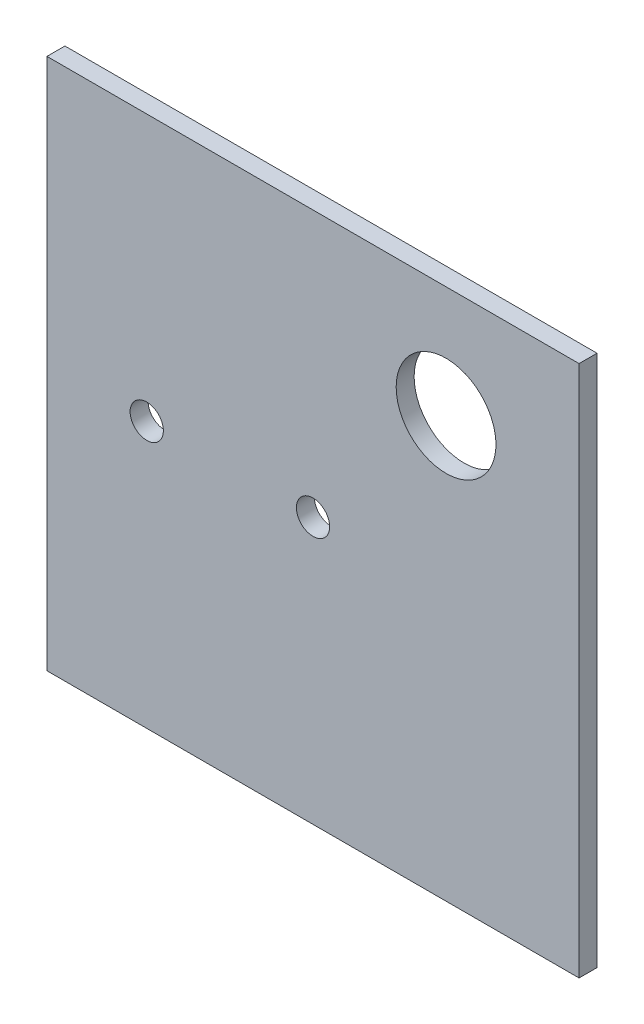
ISO-10303-21;
HEADER;
FILE_DESCRIPTION(('STEP AP214'),'2;1');
FILE_NAME('part.step','',(''),(''),'','','');
FILE_SCHEMA(('AUTOMOTIVE_DESIGN { 1 0 10303 214 1 1 1 1 }'));
ENDSEC;
DATA;
#1=APPLICATION_CONTEXT('core data for automotive mechanical design processes');
#2=APPLICATION_PROTOCOL_DEFINITION('international standard','automotive_design',2000,#1);
#3=PRODUCT_CONTEXT('',#1,'mechanical');
#4=PRODUCT('Part','Part','',(#3));
#5=PRODUCT_RELATED_PRODUCT_CATEGORY('part','',(#4));
#6=PRODUCT_DEFINITION_FORMATION('','',#4);
#7=PRODUCT_DEFINITION_CONTEXT('part definition',#1,'design');
#8=PRODUCT_DEFINITION('design','',#6,#7);
#9=PRODUCT_DEFINITION_SHAPE('','',#8);
#10=(LENGTH_UNIT() NAMED_UNIT(*) SI_UNIT(.MILLI.,.METRE.));
#11=(NAMED_UNIT(*) PLANE_ANGLE_UNIT() SI_UNIT($,.RADIAN.));
#12=(NAMED_UNIT(*) SI_UNIT($,.STERADIAN.) SOLID_ANGLE_UNIT());
#13=UNCERTAINTY_MEASURE_WITH_UNIT(LENGTH_MEASURE(1.E-05),#10,'distance_accuracy_value','');
#14=(GEOMETRIC_REPRESENTATION_CONTEXT(3) GLOBAL_UNCERTAINTY_ASSIGNED_CONTEXT((#13)) GLOBAL_UNIT_ASSIGNED_CONTEXT((#10,
#11,#12)) REPRESENTATION_CONTEXT('',''));
#15=CARTESIAN_POINT('',(0.,0.,0.));
#16=DIRECTION('',(0.,0.,1.));
#17=DIRECTION('',(1.,0.,0.));
#18=AXIS2_PLACEMENT_3D('',#15,#16,#17);
#19=CARTESIAN_POINT('',(-82.7,40.,-2.7));
#20=DIRECTION('',(-1.,0.,0.));
#21=DIRECTION('',(0.,0.,1.));
#22=AXIS2_PLACEMENT_3D('',#19,#20,#21);
#23=PLANE('',#22);
#24=DIRECTION('',(0.,-1.,0.));
#25=VECTOR('',#24,1.);
#26=CARTESIAN_POINT('',(-82.7,40.,0.));
#27=LINE('',#26,#25);
#28=CARTESIAN_POINT('',(-82.7,40.,0.));
#29=VERTEX_POINT('',#28);
#30=CARTESIAN_POINT('',(-82.7,-40.,0.));
#31=VERTEX_POINT('',#30);
#32=EDGE_CURVE('E110',#29,#31,#27,.T.);
#33=ORIENTED_EDGE('',*,*,#32,.F.);
#34=DIRECTION('',(0.,0.,1.));
#35=VECTOR('',#34,1.);
#36=CARTESIAN_POINT('',(-82.7,40.,-2.7));
#37=LINE('',#36,#35);
#38=CARTESIAN_POINT('',(-82.7,40.,-2.7));
#39=VERTEX_POINT('',#38);
#40=EDGE_CURVE('E13',#39,#29,#37,.T.);
#41=ORIENTED_EDGE('',*,*,#40,.F.);
#42=DIRECTION('',(0.,-1.,0.));
#43=VECTOR('',#42,1.);
#44=CARTESIAN_POINT('',(-82.7,40.,-2.7));
#45=LINE('',#44,#43);
#46=CARTESIAN_POINT('',(-82.7,-40.,-2.7));
#47=VERTEX_POINT('',#46);
#48=EDGE_CURVE('E103',#39,#47,#45,.T.);
#49=ORIENTED_EDGE('',*,*,#48,.T.);
#50=DIRECTION('',(0.,0.,1.));
#51=VECTOR('',#50,1.);
#52=CARTESIAN_POINT('',(-82.7,-40.,-2.7));
#53=LINE('',#52,#51);
#54=EDGE_CURVE('E48',#47,#31,#53,.T.);
#55=ORIENTED_EDGE('',*,*,#54,.T.);
#56=EDGE_LOOP('',(#33,#41,#49,#55));
#57=FACE_BOUND('',#56,.T.);
#58=ADVANCED_FACE('F45',(#57),#23,.T.);
#59=CARTESIAN_POINT('',(-82.7,40.,-2.7));
#60=DIRECTION('',(0.,1.,0.));
#61=DIRECTION('',(0.,0.,1.));
#62=AXIS2_PLACEMENT_3D('',#59,#60,#61);
#63=PLANE('',#62);
#64=DIRECTION('',(-1.,0.,0.));
#65=VECTOR('',#64,1.);
#66=CARTESIAN_POINT('',(-82.7,40.,0.));
#67=LINE('',#66,#65);
#68=CARTESIAN_POINT('',(-2.7,40.,0.));
#69=VERTEX_POINT('',#68);
#70=EDGE_CURVE('E105',#69,#29,#67,.T.);
#71=ORIENTED_EDGE('',*,*,#70,.F.);
#72=DIRECTION('',(0.,0.,1.));
#73=VECTOR('',#72,1.);
#74=CARTESIAN_POINT('',(-2.7,40.,-2.7));
#75=LINE('',#74,#73);
#76=CARTESIAN_POINT('',(-2.7,40.,-2.7));
#77=VERTEX_POINT('',#76);
#78=EDGE_CURVE('E54',#77,#69,#75,.T.);
#79=ORIENTED_EDGE('',*,*,#78,.F.);
#80=DIRECTION('',(-1.,0.,0.));
#81=VECTOR('',#80,1.);
#82=CARTESIAN_POINT('',(-82.7,40.,-2.7));
#83=LINE('',#82,#81);
#84=EDGE_CURVE('E100',#77,#39,#83,.T.);
#85=ORIENTED_EDGE('',*,*,#84,.T.);
#86=ORIENTED_EDGE('',*,*,#40,.T.);
#87=EDGE_LOOP('',(#71,#79,#85,#86));
#88=FACE_BOUND('',#87,.T.);
#89=ADVANCED_FACE('F121',(#88),#63,.T.);
#90=CARTESIAN_POINT('',(-2.7,40.,-2.7));
#91=DIRECTION('',(1.,0.,0.));
#92=DIRECTION('',(0.,0.,-1.));
#93=AXIS2_PLACEMENT_3D('',#90,#91,#92);
#94=PLANE('',#93);
#95=DIRECTION('',(0.,1.,0.));
#96=VECTOR('',#95,1.);
#97=CARTESIAN_POINT('',(-2.7,40.,0.));
#98=LINE('',#97,#96);
#99=CARTESIAN_POINT('',(-2.7,-40.,0.));
#100=VERTEX_POINT('',#99);
#101=EDGE_CURVE('E95',#100,#69,#98,.T.);
#102=ORIENTED_EDGE('',*,*,#101,.F.);
#103=DIRECTION('',(0.,0.,1.));
#104=VECTOR('',#103,1.);
#105=CARTESIAN_POINT('',(-2.7,-40.,-2.7));
#106=LINE('',#105,#104);
#107=CARTESIAN_POINT('',(-2.7,-40.,-2.7));
#108=VERTEX_POINT('',#107);
#109=EDGE_CURVE('E90',#108,#100,#106,.T.);
#110=ORIENTED_EDGE('',*,*,#109,.F.);
#111=DIRECTION('',(0.,1.,0.));
#112=VECTOR('',#111,1.);
#113=CARTESIAN_POINT('',(-2.7,40.,-2.7));
#114=LINE('',#113,#112);
#115=EDGE_CURVE('E93',#108,#77,#114,.T.);
#116=ORIENTED_EDGE('',*,*,#115,.T.);
#117=ORIENTED_EDGE('',*,*,#78,.T.);
#118=EDGE_LOOP('',(#102,#110,#116,#117));
#119=FACE_BOUND('',#118,.T.);
#120=ADVANCED_FACE('F92',(#119),#94,.T.);
#121=CARTESIAN_POINT('',(-82.7,-40.,-2.7));
#122=DIRECTION('',(0.,-1.,0.));
#123=DIRECTION('',(0.,0.,-1.));
#124=AXIS2_PLACEMENT_3D('',#121,#122,#123);
#125=PLANE('',#124);
#126=DIRECTION('',(1.,0.,0.));
#127=VECTOR('',#126,1.);
#128=CARTESIAN_POINT('',(-82.7,-40.,0.));
#129=LINE('',#128,#127);
#130=EDGE_CURVE('E113',#31,#100,#129,.T.);
#131=ORIENTED_EDGE('',*,*,#130,.F.);
#132=ORIENTED_EDGE('',*,*,#54,.F.);
#133=DIRECTION('',(1.,0.,0.));
#134=VECTOR('',#133,1.);
#135=CARTESIAN_POINT('',(-82.7,-40.,-2.7));
#136=LINE('',#135,#134);
#137=EDGE_CURVE('E99',#47,#108,#136,.T.);
#138=ORIENTED_EDGE('',*,*,#137,.T.);
#139=ORIENTED_EDGE('',*,*,#109,.T.);
#140=EDGE_LOOP('',(#131,#132,#138,#139));
#141=FACE_BOUND('',#140,.T.);
#142=ADVANCED_FACE('F102',(#141),#125,.T.);
#143=CARTESIAN_POINT('',(0.,0.,-2.7));
#144=DIRECTION('',(0.,0.,1.));
#145=DIRECTION('',(1.,0.,0.));
#146=AXIS2_PLACEMENT_3D('',#143,#144,#145);
#147=PLANE('',#146);
#148=CARTESIAN_POINT('',(-22.7,23.2,-2.7));
#149=DIRECTION('',(0.,0.,-1.));
#150=DIRECTION('',(-1.,0.,0.));
#151=AXIS2_PLACEMENT_3D('',#148,#149,#150);
#152=CIRCLE('',#151,7.5);
#153=CARTESIAN_POINT('',(-30.2,23.2,-2.7));
#154=VERTEX_POINT('',#153);
#155=EDGE_CURVE('E161',#154,#154,#152,.T.);
#156=ORIENTED_EDGE('',*,*,#155,.F.);
#157=EDGE_LOOP('',(#156));
#158=FACE_BOUND('',#157,.T.);
#159=CARTESIAN_POINT('',(-67.7,0.,-2.7));
#160=DIRECTION('',(0.,0.,-1.));
#161=DIRECTION('',(-1.,0.,0.));
#162=AXIS2_PLACEMENT_3D('',#159,#160,#161);
#163=CIRCLE('',#162,2.49999999999999);
#164=CARTESIAN_POINT('',(-70.2,0.,-2.7));
#165=VERTEX_POINT('',#164);
#166=EDGE_CURVE('E168',#165,#165,#163,.T.);
#167=ORIENTED_EDGE('',*,*,#166,.F.);
#168=EDGE_LOOP('',(#167));
#169=FACE_BOUND('',#168,.T.);
#170=CARTESIAN_POINT('',(-42.7,0.,-2.7));
#171=DIRECTION('',(0.,0.,-1.));
#172=DIRECTION('',(-1.,0.,0.));
#173=AXIS2_PLACEMENT_3D('',#170,#171,#172);
#174=CIRCLE('',#173,2.5);
#175=CARTESIAN_POINT('',(-45.2,0.,-2.7));
#176=VERTEX_POINT('',#175);
#177=EDGE_CURVE('E163',#176,#176,#174,.T.);
#178=ORIENTED_EDGE('',*,*,#177,.F.);
#179=EDGE_LOOP('',(#178));
#180=FACE_BOUND('',#179,.T.);
#181=ORIENTED_EDGE('',*,*,#48,.F.);
#182=ORIENTED_EDGE('',*,*,#84,.F.);
#183=ORIENTED_EDGE('',*,*,#115,.F.);
#184=ORIENTED_EDGE('',*,*,#137,.F.);
#185=EDGE_LOOP('',(#181,#182,#183,#184));
#186=FACE_BOUND('',#185,.T.);
#187=ADVANCED_FACE('F98',(#158,#169,#180,#186),#147,.F.);
#188=CARTESIAN_POINT('',(0.,0.,0.));
#189=DIRECTION('',(0.,0.,1.));
#190=DIRECTION('',(1.,0.,0.));
#191=AXIS2_PLACEMENT_3D('',#188,#189,#190);
#192=PLANE('',#191);
#193=CARTESIAN_POINT('',(-22.7,23.2,0.));
#194=DIRECTION('',(0.,0.,-1.));
#195=DIRECTION('',(-1.,0.,0.));
#196=AXIS2_PLACEMENT_3D('',#193,#194,#195);
#197=CIRCLE('',#196,7.5);
#198=CARTESIAN_POINT('',(-30.2,23.2,0.));
#199=VERTEX_POINT('',#198);
#200=EDGE_CURVE('E159',#199,#199,#197,.T.);
#201=ORIENTED_EDGE('',*,*,#200,.T.);
#202=EDGE_LOOP('',(#201));
#203=FACE_BOUND('',#202,.T.);
#204=CARTESIAN_POINT('',(-67.7,0.,0.));
#205=DIRECTION('',(0.,0.,-1.));
#206=DIRECTION('',(-1.,0.,0.));
#207=AXIS2_PLACEMENT_3D('',#204,#205,#206);
#208=CIRCLE('',#207,2.49999999999999);
#209=CARTESIAN_POINT('',(-70.2,0.,0.));
#210=VERTEX_POINT('',#209);
#211=EDGE_CURVE('E114',#210,#210,#208,.T.);
#212=ORIENTED_EDGE('',*,*,#211,.T.);
#213=EDGE_LOOP('',(#212));
#214=FACE_BOUND('',#213,.T.);
#215=CARTESIAN_POINT('',(-42.7,0.,0.));
#216=DIRECTION('',(0.,0.,-1.));
#217=DIRECTION('',(-1.,0.,0.));
#218=AXIS2_PLACEMENT_3D('',#215,#216,#217);
#219=CIRCLE('',#218,2.5);
#220=CARTESIAN_POINT('',(-45.2,0.,0.));
#221=VERTEX_POINT('',#220);
#222=EDGE_CURVE('E171',#221,#221,#219,.T.);
#223=ORIENTED_EDGE('',*,*,#222,.T.);
#224=EDGE_LOOP('',(#223));
#225=FACE_BOUND('',#224,.T.);
#226=ORIENTED_EDGE('',*,*,#32,.T.);
#227=ORIENTED_EDGE('',*,*,#130,.T.);
#228=ORIENTED_EDGE('',*,*,#101,.T.);
#229=ORIENTED_EDGE('',*,*,#70,.T.);
#230=EDGE_LOOP('',(#226,#227,#228,#229));
#231=FACE_BOUND('',#230,.T.);
#232=ADVANCED_FACE('F120',(#203,#214,#225,#231),#192,.T.);
#233=CARTESIAN_POINT('',(-42.7,0.,0.));
#234=DIRECTION('',(0.,0.,-1.));
#235=DIRECTION('',(-1.,0.,0.));
#236=AXIS2_PLACEMENT_3D('',#233,#234,#235);
#237=CYLINDRICAL_SURFACE('',#236,2.5);
#238=CARTESIAN_POINT('',(-45.2,0.,0.));
#239=CARTESIAN_POINT('',(-45.2,0.,-0.028125));
#240=CARTESIAN_POINT('',(-45.2,0.,-0.05625));
#241=CARTESIAN_POINT('',(-45.2,0.,-0.1125));
#242=CARTESIAN_POINT('',(-45.2,0.,-0.140625));
#243=CARTESIAN_POINT('',(-45.2,0.,-0.196875));
#244=CARTESIAN_POINT('',(-45.2,0.,-0.225));
#245=CARTESIAN_POINT('',(-45.2,0.,-0.28125));
#246=CARTESIAN_POINT('',(-45.2,0.,-0.309375));
#247=CARTESIAN_POINT('',(-45.2,0.,-0.365625));
#248=CARTESIAN_POINT('',(-45.2,0.,-0.39375));
#249=CARTESIAN_POINT('',(-45.2,0.,-0.45));
#250=CARTESIAN_POINT('',(-45.2,0.,-0.478125));
#251=CARTESIAN_POINT('',(-45.2,0.,-0.534375));
#252=CARTESIAN_POINT('',(-45.2,0.,-0.5625));
#253=CARTESIAN_POINT('',(-45.2,0.,-0.61875));
#254=CARTESIAN_POINT('',(-45.2,0.,-0.646875));
#255=CARTESIAN_POINT('',(-45.2,0.,-0.703125));
#256=CARTESIAN_POINT('',(-45.2,0.,-0.73125));
#257=CARTESIAN_POINT('',(-45.2,0.,-0.7875));
#258=CARTESIAN_POINT('',(-45.2,0.,-0.815625));
#259=CARTESIAN_POINT('',(-45.2,0.,-0.871875));
#260=CARTESIAN_POINT('',(-45.2,0.,-0.9));
#261=CARTESIAN_POINT('',(-45.2,0.,-0.95625));
#262=CARTESIAN_POINT('',(-45.2,0.,-0.984375));
#263=CARTESIAN_POINT('',(-45.2,0.,-1.040625));
#264=CARTESIAN_POINT('',(-45.2,0.,-1.06875));
#265=CARTESIAN_POINT('',(-45.2,0.,-1.125));
#266=CARTESIAN_POINT('',(-45.2,0.,-1.153125));
#267=CARTESIAN_POINT('',(-45.2,0.,-1.209375));
#268=CARTESIAN_POINT('',(-45.2,0.,-1.2375));
#269=CARTESIAN_POINT('',(-45.2,0.,-1.29375));
#270=CARTESIAN_POINT('',(-45.2,0.,-1.321875));
#271=CARTESIAN_POINT('',(-45.2,0.,-1.378125));
#272=CARTESIAN_POINT('',(-45.2,0.,-1.40625));
#273=CARTESIAN_POINT('',(-45.2,0.,-1.4625));
#274=CARTESIAN_POINT('',(-45.2,0.,-1.490625));
#275=CARTESIAN_POINT('',(-45.2,0.,-1.546875));
#276=CARTESIAN_POINT('',(-45.2,0.,-1.575));
#277=CARTESIAN_POINT('',(-45.2,0.,-1.63125));
#278=CARTESIAN_POINT('',(-45.2,0.,-1.659375));
#279=CARTESIAN_POINT('',(-45.2,0.,-1.715625));
#280=CARTESIAN_POINT('',(-45.2,0.,-1.74375));
#281=CARTESIAN_POINT('',(-45.2,0.,-1.8));
#282=CARTESIAN_POINT('',(-45.2,0.,-1.828125));
#283=CARTESIAN_POINT('',(-45.2,0.,-1.884375));
#284=CARTESIAN_POINT('',(-45.2,0.,-1.9125));
#285=CARTESIAN_POINT('',(-45.2,0.,-1.96875));
#286=CARTESIAN_POINT('',(-45.2,0.,-1.996875));
#287=CARTESIAN_POINT('',(-45.2,0.,-2.053125));
#288=CARTESIAN_POINT('',(-45.2,0.,-2.08125));
#289=CARTESIAN_POINT('',(-45.2,0.,-2.1375));
#290=CARTESIAN_POINT('',(-45.2,0.,-2.165625));
#291=CARTESIAN_POINT('',(-45.2,0.,-2.221875));
#292=CARTESIAN_POINT('',(-45.2,0.,-2.25));
#293=CARTESIAN_POINT('',(-45.2,0.,-2.30625));
#294=CARTESIAN_POINT('',(-45.2,0.,-2.334375));
#295=CARTESIAN_POINT('',(-45.2,0.,-2.390625));
#296=CARTESIAN_POINT('',(-45.2,0.,-2.41875));
#297=CARTESIAN_POINT('',(-45.2,0.,-2.475));
#298=CARTESIAN_POINT('',(-45.2,0.,-2.503125));
#299=CARTESIAN_POINT('',(-45.2,0.,-2.559375));
#300=CARTESIAN_POINT('',(-45.2,0.,-2.5875));
#301=CARTESIAN_POINT('',(-45.2,0.,-2.64375));
#302=CARTESIAN_POINT('',(-45.2,0.,-2.671875));
#303=CARTESIAN_POINT('',(-45.2,0.,-2.7));
#304=B_SPLINE_CURVE_WITH_KNOTS('',3,(#238,#239,#240,#241,#242,#243,#244,#245,#246,#247,#248,
#249,#250,#251,#252,#253,#254,#255,#256,#257,#258,#259,#260,#261,#262,#263,#264,#265,#266,#267,
#268,#269,#270,#271,#272,#273,#274,#275,#276,#277,#278,#279,#280,#281,#282,#283,#284,#285,#286,
#287,#288,#289,#290,#291,#292,#293,#294,#295,#296,#297,#298,#299,#300,#301,#302,#303),
.UNSPECIFIED.,.F.,.F.,(4,2,2,2,2,2,2,2,2,2,2,2,2,2,2,2,2,2,2,2,2,2,2,2,2,2,2,2,2,2,2,2,4),(0.,
0.084375,0.16875,0.253125,0.3375,0.421875,0.50625,0.590625,0.675,0.759375,0.84375,0.928125,
1.0125,1.096875,1.18125,1.265625,1.35,1.434375,1.51875,1.603125,1.6875,1.771875,1.85625,
1.940625,2.025,2.109375,2.19375,2.278125,2.3625,2.446875,2.53125,2.615625,2.7),.UNSPECIFIED.);
#305=EDGE_CURVE('BSEAM139',#221,#176,#304,.T.);
#306=ORIENTED_EDGE('',*,*,#222,.F.);
#307=ORIENTED_EDGE('',*,*,#177,.T.);
#308=ORIENTED_EDGE('',*,*,#305,.T.);
#309=ORIENTED_EDGE('',*,*,#305,.F.);
#310=EDGE_LOOP('',(#306,#308,#307,#309));
#311=FACE_BOUND('',#310,.T.);
#312=ADVANCED_FACE('F139',(#311),#237,.F.);
#313=CARTESIAN_POINT('',(-67.7,0.,0.));
#314=DIRECTION('',(0.,0.,-1.));
#315=DIRECTION('',(-1.,0.,0.));
#316=AXIS2_PLACEMENT_3D('',#313,#314,#315);
#317=CYLINDRICAL_SURFACE('',#316,2.49999999999999);
#318=CARTESIAN_POINT('',(-70.2,0.,0.));
#319=CARTESIAN_POINT('',(-70.2,0.,-0.028125));
#320=CARTESIAN_POINT('',(-70.2,0.,-0.05625));
#321=CARTESIAN_POINT('',(-70.2,0.,-0.1125));
#322=CARTESIAN_POINT('',(-70.2,0.,-0.140625));
#323=CARTESIAN_POINT('',(-70.2,0.,-0.196875));
#324=CARTESIAN_POINT('',(-70.2,0.,-0.225));
#325=CARTESIAN_POINT('',(-70.2,0.,-0.28125));
#326=CARTESIAN_POINT('',(-70.2,0.,-0.309375));
#327=CARTESIAN_POINT('',(-70.2,0.,-0.365625));
#328=CARTESIAN_POINT('',(-70.2,0.,-0.39375));
#329=CARTESIAN_POINT('',(-70.2,0.,-0.45));
#330=CARTESIAN_POINT('',(-70.2,0.,-0.478125));
#331=CARTESIAN_POINT('',(-70.2,0.,-0.534375));
#332=CARTESIAN_POINT('',(-70.2,0.,-0.5625));
#333=CARTESIAN_POINT('',(-70.2,0.,-0.61875));
#334=CARTESIAN_POINT('',(-70.2,0.,-0.646875));
#335=CARTESIAN_POINT('',(-70.2,0.,-0.703125));
#336=CARTESIAN_POINT('',(-70.2,0.,-0.73125));
#337=CARTESIAN_POINT('',(-70.2,0.,-0.7875));
#338=CARTESIAN_POINT('',(-70.2,0.,-0.815625));
#339=CARTESIAN_POINT('',(-70.2,0.,-0.871875));
#340=CARTESIAN_POINT('',(-70.2,0.,-0.9));
#341=CARTESIAN_POINT('',(-70.2,0.,-0.95625));
#342=CARTESIAN_POINT('',(-70.2,0.,-0.984375));
#343=CARTESIAN_POINT('',(-70.2,0.,-1.040625));
#344=CARTESIAN_POINT('',(-70.2,0.,-1.06875));
#345=CARTESIAN_POINT('',(-70.2,0.,-1.125));
#346=CARTESIAN_POINT('',(-70.2,0.,-1.153125));
#347=CARTESIAN_POINT('',(-70.2,0.,-1.209375));
#348=CARTESIAN_POINT('',(-70.2,0.,-1.2375));
#349=CARTESIAN_POINT('',(-70.2,0.,-1.29375));
#350=CARTESIAN_POINT('',(-70.2,0.,-1.321875));
#351=CARTESIAN_POINT('',(-70.2,0.,-1.378125));
#352=CARTESIAN_POINT('',(-70.2,0.,-1.40625));
#353=CARTESIAN_POINT('',(-70.2,0.,-1.4625));
#354=CARTESIAN_POINT('',(-70.2,0.,-1.490625));
#355=CARTESIAN_POINT('',(-70.2,0.,-1.546875));
#356=CARTESIAN_POINT('',(-70.2,0.,-1.575));
#357=CARTESIAN_POINT('',(-70.2,0.,-1.63125));
#358=CARTESIAN_POINT('',(-70.2,0.,-1.659375));
#359=CARTESIAN_POINT('',(-70.2,0.,-1.715625));
#360=CARTESIAN_POINT('',(-70.2,0.,-1.74375));
#361=CARTESIAN_POINT('',(-70.2,0.,-1.8));
#362=CARTESIAN_POINT('',(-70.2,0.,-1.828125));
#363=CARTESIAN_POINT('',(-70.2,0.,-1.884375));
#364=CARTESIAN_POINT('',(-70.2,0.,-1.9125));
#365=CARTESIAN_POINT('',(-70.2,0.,-1.96875));
#366=CARTESIAN_POINT('',(-70.2,0.,-1.996875));
#367=CARTESIAN_POINT('',(-70.2,0.,-2.053125));
#368=CARTESIAN_POINT('',(-70.2,0.,-2.08125));
#369=CARTESIAN_POINT('',(-70.2,0.,-2.1375));
#370=CARTESIAN_POINT('',(-70.2,0.,-2.165625));
#371=CARTESIAN_POINT('',(-70.2,0.,-2.221875));
#372=CARTESIAN_POINT('',(-70.2,0.,-2.25));
#373=CARTESIAN_POINT('',(-70.2,0.,-2.30625));
#374=CARTESIAN_POINT('',(-70.2,0.,-2.334375));
#375=CARTESIAN_POINT('',(-70.2,0.,-2.390625));
#376=CARTESIAN_POINT('',(-70.2,0.,-2.41875));
#377=CARTESIAN_POINT('',(-70.2,0.,-2.475));
#378=CARTESIAN_POINT('',(-70.2,0.,-2.503125));
#379=CARTESIAN_POINT('',(-70.2,0.,-2.559375));
#380=CARTESIAN_POINT('',(-70.2,0.,-2.5875));
#381=CARTESIAN_POINT('',(-70.2,0.,-2.64375));
#382=CARTESIAN_POINT('',(-70.2,0.,-2.671875));
#383=CARTESIAN_POINT('',(-70.2,0.,-2.7));
#384=B_SPLINE_CURVE_WITH_KNOTS('',3,(#318,#319,#320,#321,#322,#323,#324,#325,#326,#327,#328,
#329,#330,#331,#332,#333,#334,#335,#336,#337,#338,#339,#340,#341,#342,#343,#344,#345,#346,#347,
#348,#349,#350,#351,#352,#353,#354,#355,#356,#357,#358,#359,#360,#361,#362,#363,#364,#365,#366,
#367,#368,#369,#370,#371,#372,#373,#374,#375,#376,#377,#378,#379,#380,#381,#382,#383),
.UNSPECIFIED.,.F.,.F.,(4,2,2,2,2,2,2,2,2,2,2,2,2,2,2,2,2,2,2,2,2,2,2,2,2,2,2,2,2,2,2,2,4),(0.,
0.084375,0.16875,0.253125,0.3375,0.421875,0.50625,0.590625,0.675,0.759375,0.84375,0.928125,
1.0125,1.096875,1.18125,1.265625,1.35,1.434375,1.51875,1.603125,1.6875,1.771875,1.85625,
1.940625,2.025,2.109375,2.19375,2.278125,2.3625,2.446875,2.53125,2.615625,2.7),.UNSPECIFIED.);
#385=EDGE_CURVE('BSEAM146',#210,#165,#384,.T.);
#386=ORIENTED_EDGE('',*,*,#211,.F.);
#387=ORIENTED_EDGE('',*,*,#166,.T.);
#388=ORIENTED_EDGE('',*,*,#385,.T.);
#389=ORIENTED_EDGE('',*,*,#385,.F.);
#390=EDGE_LOOP('',(#386,#388,#387,#389));
#391=FACE_BOUND('',#390,.T.);
#392=ADVANCED_FACE('F146',(#391),#317,.F.);
#393=CARTESIAN_POINT('',(-22.7,23.2,0.));
#394=DIRECTION('',(0.,0.,-1.));
#395=DIRECTION('',(-1.,0.,0.));
#396=AXIS2_PLACEMENT_3D('',#393,#394,#395);
#397=CYLINDRICAL_SURFACE('',#396,7.5);
#398=CARTESIAN_POINT('',(-30.2,23.2,0.));
#399=CARTESIAN_POINT('',(-30.2,23.2,-0.028125));
#400=CARTESIAN_POINT('',(-30.2,23.2,-0.05625));
#401=CARTESIAN_POINT('',(-30.2,23.2,-0.1125));
#402=CARTESIAN_POINT('',(-30.2,23.2,-0.140625));
#403=CARTESIAN_POINT('',(-30.2,23.2,-0.196875));
#404=CARTESIAN_POINT('',(-30.2,23.2,-0.225));
#405=CARTESIAN_POINT('',(-30.2,23.2,-0.28125));
#406=CARTESIAN_POINT('',(-30.2,23.2,-0.309375));
#407=CARTESIAN_POINT('',(-30.2,23.2,-0.365625));
#408=CARTESIAN_POINT('',(-30.2,23.2,-0.39375));
#409=CARTESIAN_POINT('',(-30.2,23.2,-0.45));
#410=CARTESIAN_POINT('',(-30.2,23.2,-0.478125));
#411=CARTESIAN_POINT('',(-30.2,23.2,-0.534375));
#412=CARTESIAN_POINT('',(-30.2,23.2,-0.5625));
#413=CARTESIAN_POINT('',(-30.2,23.2,-0.61875));
#414=CARTESIAN_POINT('',(-30.2,23.2,-0.646875));
#415=CARTESIAN_POINT('',(-30.2,23.2,-0.703125));
#416=CARTESIAN_POINT('',(-30.2,23.2,-0.73125));
#417=CARTESIAN_POINT('',(-30.2,23.2,-0.7875));
#418=CARTESIAN_POINT('',(-30.2,23.2,-0.815625));
#419=CARTESIAN_POINT('',(-30.2,23.2,-0.871875));
#420=CARTESIAN_POINT('',(-30.2,23.2,-0.9));
#421=CARTESIAN_POINT('',(-30.2,23.2,-0.95625));
#422=CARTESIAN_POINT('',(-30.2,23.2,-0.984375));
#423=CARTESIAN_POINT('',(-30.2,23.2,-1.040625));
#424=CARTESIAN_POINT('',(-30.2,23.2,-1.06875));
#425=CARTESIAN_POINT('',(-30.2,23.2,-1.125));
#426=CARTESIAN_POINT('',(-30.2,23.2,-1.153125));
#427=CARTESIAN_POINT('',(-30.2,23.2,-1.209375));
#428=CARTESIAN_POINT('',(-30.2,23.2,-1.2375));
#429=CARTESIAN_POINT('',(-30.2,23.2,-1.29375));
#430=CARTESIAN_POINT('',(-30.2,23.2,-1.321875));
#431=CARTESIAN_POINT('',(-30.2,23.2,-1.378125));
#432=CARTESIAN_POINT('',(-30.2,23.2,-1.40625));
#433=CARTESIAN_POINT('',(-30.2,23.2,-1.4625));
#434=CARTESIAN_POINT('',(-30.2,23.2,-1.490625));
#435=CARTESIAN_POINT('',(-30.2,23.2,-1.546875));
#436=CARTESIAN_POINT('',(-30.2,23.2,-1.575));
#437=CARTESIAN_POINT('',(-30.2,23.2,-1.63125));
#438=CARTESIAN_POINT('',(-30.2,23.2,-1.659375));
#439=CARTESIAN_POINT('',(-30.2,23.2,-1.715625));
#440=CARTESIAN_POINT('',(-30.2,23.2,-1.74375));
#441=CARTESIAN_POINT('',(-30.2,23.2,-1.8));
#442=CARTESIAN_POINT('',(-30.2,23.2,-1.828125));
#443=CARTESIAN_POINT('',(-30.2,23.2,-1.884375));
#444=CARTESIAN_POINT('',(-30.2,23.2,-1.9125));
#445=CARTESIAN_POINT('',(-30.2,23.2,-1.96875));
#446=CARTESIAN_POINT('',(-30.2,23.2,-1.996875));
#447=CARTESIAN_POINT('',(-30.2,23.2,-2.053125));
#448=CARTESIAN_POINT('',(-30.2,23.2,-2.08125));
#449=CARTESIAN_POINT('',(-30.2,23.2,-2.1375));
#450=CARTESIAN_POINT('',(-30.2,23.2,-2.165625));
#451=CARTESIAN_POINT('',(-30.2,23.2,-2.221875));
#452=CARTESIAN_POINT('',(-30.2,23.2,-2.25));
#453=CARTESIAN_POINT('',(-30.2,23.2,-2.30625));
#454=CARTESIAN_POINT('',(-30.2,23.2,-2.334375));
#455=CARTESIAN_POINT('',(-30.2,23.2,-2.390625));
#456=CARTESIAN_POINT('',(-30.2,23.2,-2.41875));
#457=CARTESIAN_POINT('',(-30.2,23.2,-2.475));
#458=CARTESIAN_POINT('',(-30.2,23.2,-2.503125));
#459=CARTESIAN_POINT('',(-30.2,23.2,-2.559375));
#460=CARTESIAN_POINT('',(-30.2,23.2,-2.5875));
#461=CARTESIAN_POINT('',(-30.2,23.2,-2.64375));
#462=CARTESIAN_POINT('',(-30.2,23.2,-2.671875));
#463=CARTESIAN_POINT('',(-30.2,23.2,-2.7));
#464=B_SPLINE_CURVE_WITH_KNOTS('',3,(#398,#399,#400,#401,#402,#403,#404,#405,#406,#407,#408,
#409,#410,#411,#412,#413,#414,#415,#416,#417,#418,#419,#420,#421,#422,#423,#424,#425,#426,#427,
#428,#429,#430,#431,#432,#433,#434,#435,#436,#437,#438,#439,#440,#441,#442,#443,#444,#445,#446,
#447,#448,#449,#450,#451,#452,#453,#454,#455,#456,#457,#458,#459,#460,#461,#462,#463),
.UNSPECIFIED.,.F.,.F.,(4,2,2,2,2,2,2,2,2,2,2,2,2,2,2,2,2,2,2,2,2,2,2,2,2,2,2,2,2,2,2,2,4),(0.,
0.084375,0.16875,0.253125,0.3375,0.421875,0.50625,0.590625,0.675,0.759375,0.84375,0.928125,
1.0125,1.096875,1.18125,1.265625,1.35,1.434375,1.51875,1.603125,1.6875,1.771875,1.85625,
1.940625,2.025,2.109375,2.19375,2.278125,2.3625,2.446875,2.53125,2.615625,2.7),.UNSPECIFIED.);
#465=EDGE_CURVE('BSEAM150',#199,#154,#464,.T.);
#466=ORIENTED_EDGE('',*,*,#200,.F.);
#467=ORIENTED_EDGE('',*,*,#155,.T.);
#468=ORIENTED_EDGE('',*,*,#465,.T.);
#469=ORIENTED_EDGE('',*,*,#465,.F.);
#470=EDGE_LOOP('',(#466,#468,#467,#469));
#471=FACE_BOUND('',#470,.T.);
#472=ADVANCED_FACE('F150',(#471),#397,.F.);
#473=CLOSED_SHELL('',(#58,#89,#120,#142,#187,#232,#312,#392,#472));
#474=MANIFOLD_SOLID_BREP('B2',#473);
#475=ADVANCED_BREP_SHAPE_REPRESENTATION('',(#18,#474),#14);
#476=SHAPE_DEFINITION_REPRESENTATION(#9,#475);
ENDSEC;
END-ISO-10303-21;
